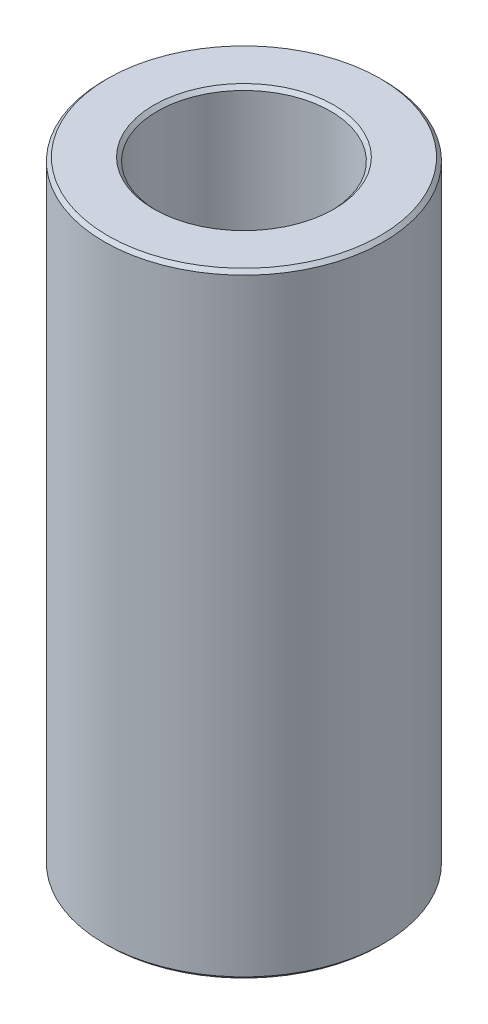
ISO-10303-21;
HEADER;
FILE_DESCRIPTION(('STEP AP214'),'2;1');
FILE_NAME('part.step','',(''),(''),'','','');
FILE_SCHEMA(('AUTOMOTIVE_DESIGN { 1 0 10303 214 1 1 1 1 }'));
ENDSEC;
DATA;
#1=APPLICATION_CONTEXT('core data for automotive mechanical design processes');
#2=APPLICATION_PROTOCOL_DEFINITION('international standard','automotive_design',2000,#1);
#3=PRODUCT_CONTEXT('',#1,'mechanical');
#4=PRODUCT('Part','Part','',(#3));
#5=PRODUCT_RELATED_PRODUCT_CATEGORY('part','',(#4));
#6=PRODUCT_DEFINITION_FORMATION('','',#4);
#7=PRODUCT_DEFINITION_CONTEXT('part definition',#1,'design');
#8=PRODUCT_DEFINITION('design','',#6,#7);
#9=PRODUCT_DEFINITION_SHAPE('','',#8);
#10=(LENGTH_UNIT() NAMED_UNIT(*) SI_UNIT(.MILLI.,.METRE.));
#11=(NAMED_UNIT(*) PLANE_ANGLE_UNIT() SI_UNIT($,.RADIAN.));
#12=(NAMED_UNIT(*) SI_UNIT($,.STERADIAN.) SOLID_ANGLE_UNIT());
#13=UNCERTAINTY_MEASURE_WITH_UNIT(LENGTH_MEASURE(1.E-05),#10,'distance_accuracy_value','');
#14=(GEOMETRIC_REPRESENTATION_CONTEXT(3) GLOBAL_UNCERTAINTY_ASSIGNED_CONTEXT((#13)) GLOBAL_UNIT_ASSIGNED_CONTEXT((#10,
#11,#12)) REPRESENTATION_CONTEXT('',''));
#15=CARTESIAN_POINT('',(0.,0.,0.));
#16=DIRECTION('',(0.,0.,1.));
#17=DIRECTION('',(1.,0.,0.));
#18=AXIS2_PLACEMENT_3D('',#15,#16,#17);
#19=CARTESIAN_POINT('',(0.,17.4625,0.));
#20=DIRECTION('',(0.,-1.,0.));
#21=DIRECTION('',(0.,0.,-1.));
#22=AXIS2_PLACEMENT_3D('',#19,#20,#21);
#23=CONICAL_SURFACE('',#22,3.86875,0.785398163397466);
#24=CARTESIAN_POINT('',(0.,17.4625,0.));
#25=DIRECTION('',(0.,1.,0.));
#26=DIRECTION('',(0.,0.,1.));
#27=AXIS2_PLACEMENT_3D('',#24,#25,#26);
#28=CIRCLE('',#27,3.86875);
#29=CARTESIAN_POINT('',(0.,17.4625,3.86875));
#30=VERTEX_POINT('',#29);
#31=EDGE_CURVE('E75',#30,#30,#28,.T.);
#32=ORIENTED_EDGE('',*,*,#31,.F.);
#33=EDGE_LOOP('',(#32));
#34=FACE_BOUND('',#33,.T.);
#35=CARTESIAN_POINT('',(0.,17.3625,0.));
#36=DIRECTION('',(0.,-1.,0.));
#37=DIRECTION('',(0.,0.,1.));
#38=AXIS2_PLACEMENT_3D('',#35,#36,#37);
#39=CIRCLE('',#38,3.96875);
#40=CARTESIAN_POINT('',(0.,17.3625,3.96875));
#41=VERTEX_POINT('',#40);
#42=EDGE_CURVE('E53',#41,#41,#39,.T.);
#43=ORIENTED_EDGE('',*,*,#42,.F.);
#44=EDGE_LOOP('',(#43));
#45=FACE_BOUND('',#44,.T.);
#46=ADVANCED_FACE('F16',(#34,#45),#23,.T.);
#47=CARTESIAN_POINT('',(0.,0.0999999999999959,0.));
#48=DIRECTION('',(0.,1.,0.));
#49=DIRECTION('',(0.,0.,1.));
#50=AXIS2_PLACEMENT_3D('',#47,#48,#49);
#51=CONICAL_SURFACE('',#50,3.96875,0.785398163397457);
#52=CARTESIAN_POINT('',(0.,0.,0.));
#53=DIRECTION('',(0.,-1.,0.));
#54=DIRECTION('',(0.,0.,1.));
#55=AXIS2_PLACEMENT_3D('',#52,#53,#54);
#56=CIRCLE('',#55,3.86875);
#57=CARTESIAN_POINT('',(0.,0.,3.86875));
#58=VERTEX_POINT('',#57);
#59=EDGE_CURVE('E20',#58,#58,#56,.T.);
#60=ORIENTED_EDGE('',*,*,#59,.F.);
#61=EDGE_LOOP('',(#60));
#62=FACE_BOUND('',#61,.T.);
#63=CARTESIAN_POINT('',(0.,0.0999999999999959,0.));
#64=DIRECTION('',(0.,1.,0.));
#65=DIRECTION('',(0.,0.,1.));
#66=AXIS2_PLACEMENT_3D('',#63,#64,#65);
#67=CIRCLE('',#66,3.96875);
#68=CARTESIAN_POINT('',(0.,0.0999999999999959,3.96875));
#69=VERTEX_POINT('',#68);
#70=EDGE_CURVE('E87',#69,#69,#67,.T.);
#71=ORIENTED_EDGE('',*,*,#70,.F.);
#72=EDGE_LOOP('',(#71));
#73=FACE_BOUND('',#72,.T.);
#74=ADVANCED_FACE('F103',(#62,#73),#51,.T.);
#75=CARTESIAN_POINT('',(0.,17.3625,0.));
#76=DIRECTION('',(0.,1.,0.));
#77=DIRECTION('',(0.,0.,1.));
#78=AXIS2_PLACEMENT_3D('',#75,#76,#77);
#79=CONICAL_SURFACE('',#78,2.46,0.785398163397442);
#80=CARTESIAN_POINT('',(0.,17.3625,0.));
#81=DIRECTION('',(0.,1.,0.));
#82=DIRECTION('',(0.,0.,1.));
#83=AXIS2_PLACEMENT_3D('',#80,#81,#82);
#84=CIRCLE('',#83,2.46);
#85=CARTESIAN_POINT('',(0.,17.3625,2.46));
#86=VERTEX_POINT('',#85);
#87=EDGE_CURVE('E27',#86,#86,#84,.T.);
#88=ORIENTED_EDGE('',*,*,#87,.F.);
#89=EDGE_LOOP('',(#88));
#90=FACE_BOUND('',#89,.T.);
#91=CARTESIAN_POINT('',(0.,17.4625,0.));
#92=DIRECTION('',(0.,-1.,0.));
#93=DIRECTION('',(0.,0.,1.));
#94=AXIS2_PLACEMENT_3D('',#91,#92,#93);
#95=CIRCLE('',#94,2.56);
#96=CARTESIAN_POINT('',(0.,17.4625,2.56));
#97=VERTEX_POINT('',#96);
#98=EDGE_CURVE('E79',#97,#97,#95,.T.);
#99=ORIENTED_EDGE('',*,*,#98,.F.);
#100=EDGE_LOOP('',(#99));
#101=FACE_BOUND('',#100,.T.);
#102=ADVANCED_FACE('F106',(#90,#101),#79,.F.);
#103=CARTESIAN_POINT('',(0.,0.,0.));
#104=DIRECTION('',(0.,-1.,0.));
#105=DIRECTION('',(0.,0.,-1.));
#106=AXIS2_PLACEMENT_3D('',#103,#104,#105);
#107=CONICAL_SURFACE('',#106,2.56,0.785398163397434);
#108=CARTESIAN_POINT('',(0.,0.1,0.));
#109=DIRECTION('',(0.,-1.,0.));
#110=DIRECTION('',(0.,0.,1.));
#111=AXIS2_PLACEMENT_3D('',#108,#109,#110);
#112=CIRCLE('',#111,2.46);
#113=CARTESIAN_POINT('',(0.,0.1,2.46));
#114=VERTEX_POINT('',#113);
#115=EDGE_CURVE('E11',#114,#114,#112,.T.);
#116=ORIENTED_EDGE('',*,*,#115,.F.);
#117=EDGE_LOOP('',(#116));
#118=FACE_BOUND('',#117,.T.);
#119=CARTESIAN_POINT('',(0.,0.,0.));
#120=DIRECTION('',(0.,1.,0.));
#121=DIRECTION('',(0.,0.,1.));
#122=AXIS2_PLACEMENT_3D('',#119,#120,#121);
#123=CIRCLE('',#122,2.56);
#124=CARTESIAN_POINT('',(0.,0.,2.56));
#125=VERTEX_POINT('',#124);
#126=EDGE_CURVE('E62',#125,#125,#123,.T.);
#127=ORIENTED_EDGE('',*,*,#126,.F.);
#128=EDGE_LOOP('',(#127));
#129=FACE_BOUND('',#128,.T.);
#130=ADVANCED_FACE('F18',(#118,#129),#107,.F.);
#131=CARTESIAN_POINT('',(0.,17.4625,0.));
#132=DIRECTION('',(0.,-1.,0.));
#133=DIRECTION('',(0.,0.,-1.));
#134=AXIS2_PLACEMENT_3D('',#131,#132,#133);
#135=CYLINDRICAL_SURFACE('',#134,2.46);
#136=ORIENTED_EDGE('',*,*,#115,.T.);
#137=EDGE_LOOP('',(#136));
#138=FACE_BOUND('',#137,.T.);
#139=ORIENTED_EDGE('',*,*,#87,.T.);
#140=EDGE_LOOP('',(#139));
#141=FACE_BOUND('',#140,.T.);
#142=ADVANCED_FACE('F111',(#138,#141),#135,.F.);
#143=CARTESIAN_POINT('',(0.,17.4625,0.));
#144=DIRECTION('',(0.,-1.,0.));
#145=DIRECTION('',(0.,0.,-1.));
#146=AXIS2_PLACEMENT_3D('',#143,#144,#145);
#147=CYLINDRICAL_SURFACE('',#146,3.96875);
#148=ORIENTED_EDGE('',*,*,#70,.T.);
#149=EDGE_LOOP('',(#148));
#150=FACE_BOUND('',#149,.T.);
#151=ORIENTED_EDGE('',*,*,#42,.T.);
#152=EDGE_LOOP('',(#151));
#153=FACE_BOUND('',#152,.T.);
#154=ADVANCED_FACE('F109',(#150,#153),#147,.T.);
#155=CARTESIAN_POINT('',(0.,0.,0.));
#156=DIRECTION('',(0.,1.,0.));
#157=DIRECTION('',(1.,0.,0.));
#158=AXIS2_PLACEMENT_3D('',#155,#156,#157);
#159=PLANE('',#158);
#160=ORIENTED_EDGE('',*,*,#126,.T.);
#161=EDGE_LOOP('',(#160));
#162=FACE_BOUND('',#161,.T.);
#163=ORIENTED_EDGE('',*,*,#59,.T.);
#164=EDGE_LOOP('',(#163));
#165=FACE_BOUND('',#164,.T.);
#166=ADVANCED_FACE('F101',(#162,#165),#159,.F.);
#167=CARTESIAN_POINT('',(0.,17.4625,0.));
#168=DIRECTION('',(0.,1.,0.));
#169=DIRECTION('',(1.,0.,0.));
#170=AXIS2_PLACEMENT_3D('',#167,#168,#169);
#171=PLANE('',#170);
#172=ORIENTED_EDGE('',*,*,#98,.T.);
#173=EDGE_LOOP('',(#172));
#174=FACE_BOUND('',#173,.T.);
#175=ORIENTED_EDGE('',*,*,#31,.T.);
#176=EDGE_LOOP('',(#175));
#177=FACE_BOUND('',#176,.T.);
#178=ADVANCED_FACE('F76',(#174,#177),#171,.T.);
#179=CLOSED_SHELL('',(#46,#74,#102,#130,#142,#154,#166,#178));
#180=MANIFOLD_SOLID_BREP('B1',#179);
#181=ADVANCED_BREP_SHAPE_REPRESENTATION('',(#18,#180),#14);
#182=SHAPE_DEFINITION_REPRESENTATION(#9,#181);
ENDSEC;
END-ISO-10303-21;
